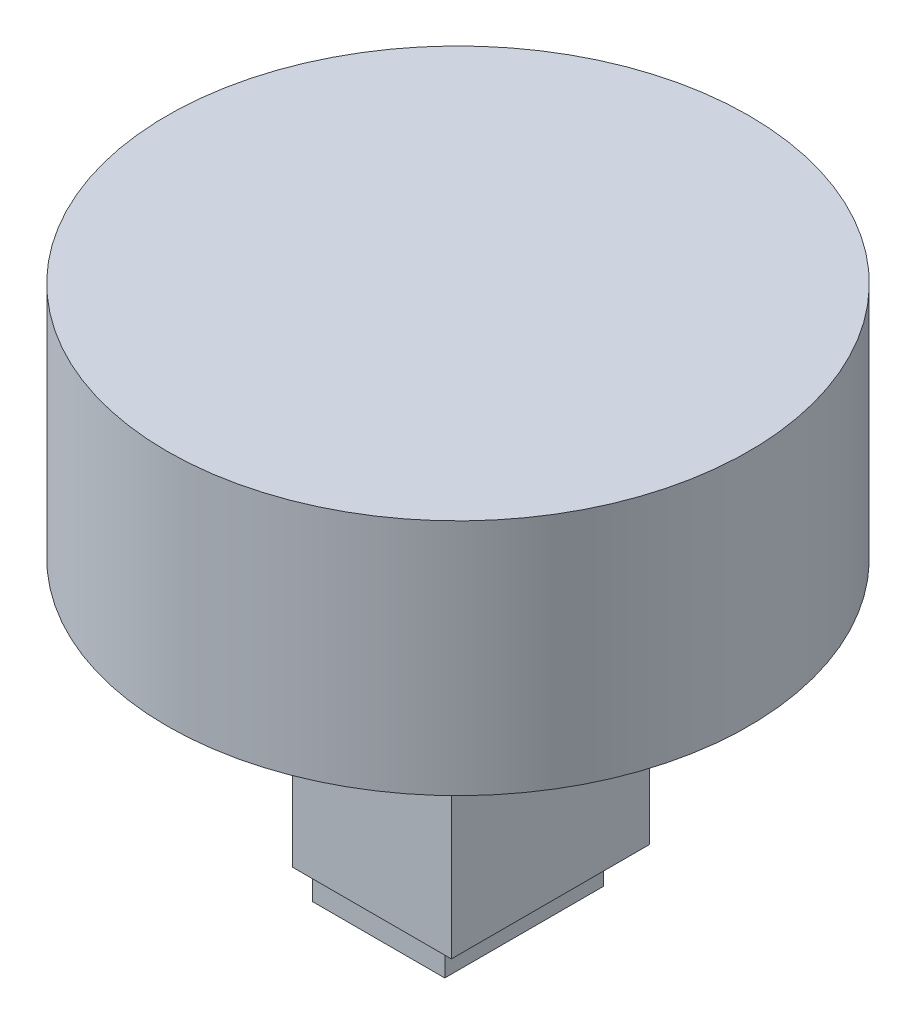
ISO-10303-21;
HEADER;
FILE_DESCRIPTION(('STEP AP214'),'2;1');
FILE_NAME('part.step','',(''),(''),'','','');
FILE_SCHEMA(('AUTOMOTIVE_DESIGN { 1 0 10303 214 1 1 1 1 }'));
ENDSEC;
DATA;
#1=APPLICATION_CONTEXT('core data for automotive mechanical design processes');
#2=APPLICATION_PROTOCOL_DEFINITION('international standard','automotive_design',2000,#1);
#3=PRODUCT_CONTEXT('',#1,'mechanical');
#4=PRODUCT('Part','Part','',(#3));
#5=PRODUCT_RELATED_PRODUCT_CATEGORY('part','',(#4));
#6=PRODUCT_DEFINITION_FORMATION('','',#4);
#7=PRODUCT_DEFINITION_CONTEXT('part definition',#1,'design');
#8=PRODUCT_DEFINITION('design','',#6,#7);
#9=PRODUCT_DEFINITION_SHAPE('','',#8);
#10=(LENGTH_UNIT() NAMED_UNIT(*) SI_UNIT(.MILLI.,.METRE.));
#11=(NAMED_UNIT(*) PLANE_ANGLE_UNIT() SI_UNIT($,.RADIAN.));
#12=(NAMED_UNIT(*) SI_UNIT($,.STERADIAN.) SOLID_ANGLE_UNIT());
#13=UNCERTAINTY_MEASURE_WITH_UNIT(LENGTH_MEASURE(1.E-05),#10,'distance_accuracy_value','');
#14=(GEOMETRIC_REPRESENTATION_CONTEXT(3) GLOBAL_UNCERTAINTY_ASSIGNED_CONTEXT((#13)) GLOBAL_UNIT_ASSIGNED_CONTEXT((#10,
#11,#12)) REPRESENTATION_CONTEXT('',''));
#15=CARTESIAN_POINT('',(0.,0.,0.));
#16=DIRECTION('',(0.,0.,1.));
#17=DIRECTION('',(1.,0.,0.));
#18=AXIS2_PLACEMENT_3D('',#15,#16,#17);
#19=CARTESIAN_POINT('',(5.,-22.,6.));
#20=DIRECTION('',(-1.,0.,0.));
#21=DIRECTION('',(0.,0.,1.));
#22=AXIS2_PLACEMENT_3D('',#19,#20,#21);
#23=PLANE('',#22);
#24=DIRECTION('',(0.,1.,0.));
#25=VECTOR('',#24,1.);
#26=CARTESIAN_POINT('',(5.,-22.,-6.));
#27=LINE('',#26,#25);
#28=CARTESIAN_POINT('',(5.,-22.,-6.));
#29=VERTEX_POINT('',#28);
#30=CARTESIAN_POINT('',(5.,-19.,-6.));
#31=VERTEX_POINT('',#30);
#32=EDGE_CURVE('E199',#29,#31,#27,.T.);
#33=ORIENTED_EDGE('',*,*,#32,.T.);
#34=DIRECTION('',(0.,0.,1.));
#35=VECTOR('',#34,1.);
#36=CARTESIAN_POINT('',(5.,-19.,6.));
#37=LINE('',#36,#35);
#38=CARTESIAN_POINT('',(5.,-19.,6.));
#39=VERTEX_POINT('',#38);
#40=EDGE_CURVE('E58',#31,#39,#37,.T.);
#41=ORIENTED_EDGE('',*,*,#40,.T.);
#42=DIRECTION('',(0.,1.,0.));
#43=VECTOR('',#42,1.);
#44=CARTESIAN_POINT('',(5.,-22.,6.));
#45=LINE('',#44,#43);
#46=CARTESIAN_POINT('',(5.,-22.,6.));
#47=VERTEX_POINT('',#46);
#48=EDGE_CURVE('E209',#47,#39,#45,.T.);
#49=ORIENTED_EDGE('',*,*,#48,.F.);
#50=DIRECTION('',(0.,0.,1.));
#51=VECTOR('',#50,1.);
#52=CARTESIAN_POINT('',(5.,-22.,6.));
#53=LINE('',#52,#51);
#54=EDGE_CURVE('E178',#29,#47,#53,.T.);
#55=ORIENTED_EDGE('',*,*,#54,.F.);
#56=EDGE_LOOP('',(#33,#41,#49,#55));
#57=FACE_BOUND('',#56,.T.);
#58=ADVANCED_FACE('F35',(#57),#23,.F.);
#59=CARTESIAN_POINT('',(-5.,-22.,6.));
#60=DIRECTION('',(0.,0.,-1.));
#61=DIRECTION('',(-1.,0.,0.));
#62=AXIS2_PLACEMENT_3D('',#59,#60,#61);
#63=PLANE('',#62);
#64=ORIENTED_EDGE('',*,*,#48,.T.);
#65=DIRECTION('',(-1.,0.,0.));
#66=VECTOR('',#65,1.);
#67=CARTESIAN_POINT('',(-5.,-19.,6.));
#68=LINE('',#67,#66);
#69=CARTESIAN_POINT('',(-5.,-19.,6.));
#70=VERTEX_POINT('',#69);
#71=EDGE_CURVE('E175',#39,#70,#68,.T.);
#72=ORIENTED_EDGE('',*,*,#71,.T.);
#73=DIRECTION('',(0.,1.,0.));
#74=VECTOR('',#73,1.);
#75=CARTESIAN_POINT('',(-5.,-22.,6.));
#76=LINE('',#75,#74);
#77=CARTESIAN_POINT('',(-5.,-22.,6.));
#78=VERTEX_POINT('',#77);
#79=EDGE_CURVE('E205',#78,#70,#76,.T.);
#80=ORIENTED_EDGE('',*,*,#79,.F.);
#81=DIRECTION('',(-1.,0.,0.));
#82=VECTOR('',#81,1.);
#83=CARTESIAN_POINT('',(-5.,-22.,6.));
#84=LINE('',#83,#82);
#85=EDGE_CURVE('E181',#47,#78,#84,.T.);
#86=ORIENTED_EDGE('',*,*,#85,.F.);
#87=EDGE_LOOP('',(#64,#72,#80,#86));
#88=FACE_BOUND('',#87,.T.);
#89=ADVANCED_FACE('F254',(#88),#63,.F.);
#90=CARTESIAN_POINT('',(-5.,-22.,-6.));
#91=DIRECTION('',(0.,0.,1.));
#92=DIRECTION('',(1.,0.,0.));
#93=AXIS2_PLACEMENT_3D('',#90,#91,#92);
#94=PLANE('',#93);
#95=DIRECTION('',(0.,1.,0.));
#96=VECTOR('',#95,1.);
#97=CARTESIAN_POINT('',(-5.,-22.,-6.));
#98=LINE('',#97,#96);
#99=CARTESIAN_POINT('',(-5.,-22.,-6.));
#100=VERTEX_POINT('',#99);
#101=CARTESIAN_POINT('',(-5.,-19.,-6.));
#102=VERTEX_POINT('',#101);
#103=EDGE_CURVE('E202',#100,#102,#98,.T.);
#104=ORIENTED_EDGE('',*,*,#103,.T.);
#105=DIRECTION('',(1.,0.,0.));
#106=VECTOR('',#105,1.);
#107=CARTESIAN_POINT('',(-5.,-19.,-6.));
#108=LINE('',#107,#106);
#109=EDGE_CURVE('E11',#102,#31,#108,.T.);
#110=ORIENTED_EDGE('',*,*,#109,.T.);
#111=ORIENTED_EDGE('',*,*,#32,.F.);
#112=DIRECTION('',(1.,0.,0.));
#113=VECTOR('',#112,1.);
#114=CARTESIAN_POINT('',(-5.,-22.,-6.));
#115=LINE('',#114,#113);
#116=EDGE_CURVE('E186',#100,#29,#115,.T.);
#117=ORIENTED_EDGE('',*,*,#116,.F.);
#118=EDGE_LOOP('',(#104,#110,#111,#117));
#119=FACE_BOUND('',#118,.T.);
#120=ADVANCED_FACE('F248',(#119),#94,.F.);
#121=CARTESIAN_POINT('',(0.,0.,0.));
#122=DIRECTION('',(0.,1.,0.));
#123=DIRECTION('',(0.,0.,1.));
#124=AXIS2_PLACEMENT_3D('',#121,#122,#123);
#125=PLANE('',#124);
#126=CARTESIAN_POINT('',(0.,0.,0.));
#127=DIRECTION('',(0.,1.,0.));
#128=DIRECTION('',(0.,0.,1.));
#129=AXIS2_PLACEMENT_3D('',#126,#127,#128);
#130=CIRCLE('',#129,22.);
#131=CARTESIAN_POINT('',(0.,0.,22.));
#132=VERTEX_POINT('',#131);
#133=EDGE_CURVE('E211',#132,#132,#130,.T.);
#134=ORIENTED_EDGE('',*,*,#133,.F.);
#135=EDGE_LOOP('',(#134));
#136=FACE_BOUND('',#135,.T.);
#137=DIRECTION('',(0.,0.,1.));
#138=VECTOR('',#137,1.);
#139=CARTESIAN_POINT('',(5.,0.,6.));
#140=LINE('',#139,#138);
#141=CARTESIAN_POINT('',(5.,0.,-6.));
#142=VERTEX_POINT('',#141);
#143=CARTESIAN_POINT('',(5.,0.,6.));
#144=VERTEX_POINT('',#143);
#145=EDGE_CURVE('E177',#142,#144,#140,.T.);
#146=ORIENTED_EDGE('',*,*,#145,.F.);
#147=DIRECTION('',(1.,0.,0.));
#148=VECTOR('',#147,1.);
#149=CARTESIAN_POINT('',(-5.,0.,-6.));
#150=LINE('',#149,#148);
#151=CARTESIAN_POINT('',(-5.,0.,-6.));
#152=VERTEX_POINT('',#151);
#153=EDGE_CURVE('E182',#152,#142,#150,.T.);
#154=ORIENTED_EDGE('',*,*,#153,.F.);
#155=DIRECTION('',(0.,0.,-1.));
#156=VECTOR('',#155,1.);
#157=CARTESIAN_POINT('',(-5.,0.,6.));
#158=LINE('',#157,#156);
#159=CARTESIAN_POINT('',(-5.,0.,6.));
#160=VERTEX_POINT('',#159);
#161=EDGE_CURVE('E194',#160,#152,#158,.T.);
#162=ORIENTED_EDGE('',*,*,#161,.F.);
#163=DIRECTION('',(-1.,0.,0.));
#164=VECTOR('',#163,1.);
#165=CARTESIAN_POINT('',(-5.,0.,6.));
#166=LINE('',#165,#164);
#167=EDGE_CURVE('E191',#144,#160,#166,.T.);
#168=ORIENTED_EDGE('',*,*,#167,.F.);
#169=EDGE_LOOP('',(#146,#154,#162,#168));
#170=FACE_BOUND('',#169,.T.);
#171=ADVANCED_FACE('F230',(#136,#170),#125,.F.);
#172=CARTESIAN_POINT('',(0.,18.,0.));
#173=DIRECTION('',(0.,-1.,0.));
#174=DIRECTION('',(0.,0.,-1.));
#175=AXIS2_PLACEMENT_3D('',#172,#173,#174);
#176=CYLINDRICAL_SURFACE('',#175,22.);
#177=CARTESIAN_POINT('',(0.,18.,0.));
#178=DIRECTION('',(0.,1.,0.));
#179=DIRECTION('',(0.,0.,1.));
#180=AXIS2_PLACEMENT_3D('',#177,#178,#179);
#181=CIRCLE('',#180,22.);
#182=CARTESIAN_POINT('',(0.,18.,22.));
#183=VERTEX_POINT('',#182);
#184=EDGE_CURVE('E212',#183,#183,#181,.T.);
#185=ORIENTED_EDGE('',*,*,#184,.F.);
#186=EDGE_LOOP('',(#185));
#187=FACE_BOUND('',#186,.T.);
#188=ORIENTED_EDGE('',*,*,#133,.T.);
#189=EDGE_LOOP('',(#188));
#190=FACE_BOUND('',#189,.T.);
#191=ADVANCED_FACE('F37',(#187,#190),#176,.T.);
#192=CARTESIAN_POINT('',(0.,18.,0.));
#193=DIRECTION('',(0.,1.,0.));
#194=DIRECTION('',(0.,0.,1.));
#195=AXIS2_PLACEMENT_3D('',#192,#193,#194);
#196=PLANE('',#195);
#197=ORIENTED_EDGE('',*,*,#184,.T.);
#198=EDGE_LOOP('',(#197));
#199=FACE_BOUND('',#198,.T.);
#200=ADVANCED_FACE('F263',(#199),#196,.T.);
#201=CARTESIAN_POINT('',(5.,-7.,6.));
#202=VERTEX_POINT('',#201);
#203=EDGE_CURVE('E208',#202,#144,#45,.T.);
#204=ORIENTED_EDGE('',*,*,#203,.F.);
#205=DIRECTION('',(0.,0.,-1.));
#206=VECTOR('',#205,1.);
#207=CARTESIAN_POINT('',(5.,-7.,6.));
#208=LINE('',#207,#206);
#209=CARTESIAN_POINT('',(5.,-7.,-6.));
#210=VERTEX_POINT('',#209);
#211=EDGE_CURVE('E171',#202,#210,#208,.T.);
#212=ORIENTED_EDGE('',*,*,#211,.T.);
#213=EDGE_CURVE('E188',#210,#142,#27,.T.);
#214=ORIENTED_EDGE('',*,*,#213,.T.);
#215=ORIENTED_EDGE('',*,*,#145,.T.);
#216=EDGE_LOOP('',(#204,#212,#214,#215));
#217=FACE_BOUND('',#216,.T.);
#218=ADVANCED_FACE('F233',(#217),#23,.F.);
#219=CARTESIAN_POINT('',(-5.,-7.,6.));
#220=VERTEX_POINT('',#219);
#221=EDGE_CURVE('E204',#220,#160,#76,.T.);
#222=ORIENTED_EDGE('',*,*,#221,.F.);
#223=DIRECTION('',(1.,0.,0.));
#224=VECTOR('',#223,1.);
#225=CARTESIAN_POINT('',(-5.,-7.,6.));
#226=LINE('',#225,#224);
#227=EDGE_CURVE('E50',#220,#202,#226,.T.);
#228=ORIENTED_EDGE('',*,*,#227,.T.);
#229=ORIENTED_EDGE('',*,*,#203,.T.);
#230=ORIENTED_EDGE('',*,*,#167,.T.);
#231=EDGE_LOOP('',(#222,#228,#229,#230));
#232=FACE_BOUND('',#231,.T.);
#233=ADVANCED_FACE('F231',(#232),#63,.F.);
#234=CARTESIAN_POINT('',(-5.,-22.,6.));
#235=DIRECTION('',(1.,0.,0.));
#236=DIRECTION('',(0.,0.,-1.));
#237=AXIS2_PLACEMENT_3D('',#234,#235,#236);
#238=PLANE('',#237);
#239=CARTESIAN_POINT('',(-5.,-7.,-6.));
#240=VERTEX_POINT('',#239);
#241=EDGE_CURVE('E201',#240,#152,#98,.T.);
#242=ORIENTED_EDGE('',*,*,#241,.F.);
#243=DIRECTION('',(0.,0.,-1.));
#244=VECTOR('',#243,1.);
#245=CARTESIAN_POINT('',(-5.,-7.,7.5));
#246=LINE('',#245,#244);
#247=CARTESIAN_POINT('',(-5.,-7.,-7.50000000000001));
#248=VERTEX_POINT('',#247);
#249=EDGE_CURVE('E163',#240,#248,#246,.T.);
#250=ORIENTED_EDGE('',*,*,#249,.T.);
#251=DIRECTION('',(0.,-1.,0.));
#252=VECTOR('',#251,1.);
#253=CARTESIAN_POINT('',(-5.,-19.,-7.5));
#254=LINE('',#253,#252);
#255=CARTESIAN_POINT('',(-5.,-19.,-7.5));
#256=VERTEX_POINT('',#255);
#257=EDGE_CURVE('E132',#248,#256,#254,.T.);
#258=ORIENTED_EDGE('',*,*,#257,.T.);
#259=DIRECTION('',(0.,0.,1.));
#260=VECTOR('',#259,1.);
#261=CARTESIAN_POINT('',(-5.,-19.,7.5));
#262=LINE('',#261,#260);
#263=EDGE_CURVE('E159',#256,#102,#262,.T.);
#264=ORIENTED_EDGE('',*,*,#263,.T.);
#265=ORIENTED_EDGE('',*,*,#103,.F.);
#266=DIRECTION('',(0.,0.,-1.));
#267=VECTOR('',#266,1.);
#268=CARTESIAN_POINT('',(-5.,-22.,6.));
#269=LINE('',#268,#267);
#270=EDGE_CURVE('E184',#78,#100,#269,.T.);
#271=ORIENTED_EDGE('',*,*,#270,.F.);
#272=ORIENTED_EDGE('',*,*,#79,.T.);
#273=CARTESIAN_POINT('',(-5.,-19.,7.5));
#274=VERTEX_POINT('',#273);
#275=EDGE_CURVE('E157',#70,#274,#262,.T.);
#276=ORIENTED_EDGE('',*,*,#275,.T.);
#277=DIRECTION('',(0.,1.,0.));
#278=VECTOR('',#277,1.);
#279=CARTESIAN_POINT('',(-5.,-19.,7.5));
#280=LINE('',#279,#278);
#281=CARTESIAN_POINT('',(-5.,-7.,7.5));
#282=VERTEX_POINT('',#281);
#283=EDGE_CURVE('E155',#274,#282,#280,.T.);
#284=ORIENTED_EDGE('',*,*,#283,.T.);
#285=EDGE_CURVE('E168',#282,#220,#246,.T.);
#286=ORIENTED_EDGE('',*,*,#285,.T.);
#287=ORIENTED_EDGE('',*,*,#221,.T.);
#288=ORIENTED_EDGE('',*,*,#161,.T.);
#289=EDGE_LOOP('',(#242,#250,#258,#264,#265,#271,#272,#276,#284,#286,#287,#288));
#290=FACE_BOUND('',#289,.T.);
#291=ADVANCED_FACE('F224',(#290),#238,.F.);
#292=ORIENTED_EDGE('',*,*,#213,.F.);
#293=DIRECTION('',(-1.,0.,0.));
#294=VECTOR('',#293,1.);
#295=CARTESIAN_POINT('',(-5.,-7.,-6.));
#296=LINE('',#295,#294);
#297=EDGE_CURVE('E43',#210,#240,#296,.T.);
#298=ORIENTED_EDGE('',*,*,#297,.T.);
#299=ORIENTED_EDGE('',*,*,#241,.T.);
#300=ORIENTED_EDGE('',*,*,#153,.T.);
#301=EDGE_LOOP('',(#292,#298,#299,#300));
#302=FACE_BOUND('',#301,.T.);
#303=ADVANCED_FACE('F220',(#302),#94,.F.);
#304=CARTESIAN_POINT('',(0.,-22.,0.));
#305=DIRECTION('',(0.,-1.,0.));
#306=DIRECTION('',(0.,0.,-1.));
#307=AXIS2_PLACEMENT_3D('',#304,#305,#306);
#308=PLANE('',#307);
#309=ORIENTED_EDGE('',*,*,#54,.T.);
#310=ORIENTED_EDGE('',*,*,#85,.T.);
#311=ORIENTED_EDGE('',*,*,#270,.T.);
#312=ORIENTED_EDGE('',*,*,#116,.T.);
#313=EDGE_LOOP('',(#309,#310,#311,#312));
#314=FACE_BOUND('',#313,.T.);
#315=ADVANCED_FACE('F251',(#314),#308,.T.);
#316=CARTESIAN_POINT('',(-24.2093727122985,-19.,7.49999999999999));
#317=DIRECTION('',(0.,-1.,0.));
#318=DIRECTION('',(0.,0.,-1.));
#319=AXIS2_PLACEMENT_3D('',#316,#317,#318);
#320=PLANE('',#319);
#321=ORIENTED_EDGE('',*,*,#71,.F.);
#322=ORIENTED_EDGE('',*,*,#40,.F.);
#323=ORIENTED_EDGE('',*,*,#109,.F.);
#324=ORIENTED_EDGE('',*,*,#263,.F.);
#325=DIRECTION('',(1.,0.,0.));
#326=VECTOR('',#325,1.);
#327=CARTESIAN_POINT('',(-24.2093727122985,-19.,-7.50000000000001));
#328=LINE('',#327,#326);
#329=CARTESIAN_POINT('',(7.,-19.,-7.5));
#330=VERTEX_POINT('',#329);
#331=EDGE_CURVE('E158',#256,#330,#328,.T.);
#332=ORIENTED_EDGE('',*,*,#331,.T.);
#333=DIRECTION('',(0.,0.,-1.));
#334=VECTOR('',#333,1.);
#335=CARTESIAN_POINT('',(7.,-19.,7.5));
#336=LINE('',#335,#334);
#337=CARTESIAN_POINT('',(7.,-19.,7.5));
#338=VERTEX_POINT('',#337);
#339=EDGE_CURVE('E136',#338,#330,#336,.T.);
#340=ORIENTED_EDGE('',*,*,#339,.F.);
#341=DIRECTION('',(1.,0.,0.));
#342=VECTOR('',#341,1.);
#343=CARTESIAN_POINT('',(-24.2093727122985,-19.,7.49999999999999));
#344=LINE('',#343,#342);
#345=EDGE_CURVE('E165',#274,#338,#344,.T.);
#346=ORIENTED_EDGE('',*,*,#345,.F.);
#347=ORIENTED_EDGE('',*,*,#275,.F.);
#348=EDGE_LOOP('',(#321,#322,#323,#324,#332,#340,#346,#347));
#349=FACE_BOUND('',#348,.T.);
#350=ADVANCED_FACE('F241',(#349),#320,.T.);
#351=CARTESIAN_POINT('',(-24.2093727122985,-7.,7.49999999999999));
#352=DIRECTION('',(0.,1.,0.));
#353=DIRECTION('',(0.,0.,1.));
#354=AXIS2_PLACEMENT_3D('',#351,#352,#353);
#355=PLANE('',#354);
#356=ORIENTED_EDGE('',*,*,#227,.F.);
#357=ORIENTED_EDGE('',*,*,#285,.F.);
#358=DIRECTION('',(1.,0.,0.));
#359=VECTOR('',#358,1.);
#360=CARTESIAN_POINT('',(-24.2093727122985,-7.,7.49999999999999));
#361=LINE('',#360,#359);
#362=CARTESIAN_POINT('',(7.,-7.,7.5));
#363=VERTEX_POINT('',#362);
#364=EDGE_CURVE('E135',#282,#363,#361,.T.);
#365=ORIENTED_EDGE('',*,*,#364,.T.);
#366=DIRECTION('',(0.,0.,1.));
#367=VECTOR('',#366,1.);
#368=CARTESIAN_POINT('',(7.,-7.,7.5));
#369=LINE('',#368,#367);
#370=CARTESIAN_POINT('',(7.,-7.,-7.5));
#371=VERTEX_POINT('',#370);
#372=EDGE_CURVE('E139',#371,#363,#369,.T.);
#373=ORIENTED_EDGE('',*,*,#372,.F.);
#374=DIRECTION('',(1.,0.,0.));
#375=VECTOR('',#374,1.);
#376=CARTESIAN_POINT('',(-24.2093727122985,-7.,-7.50000000000001));
#377=LINE('',#376,#375);
#378=EDGE_CURVE('E126',#248,#371,#377,.T.);
#379=ORIENTED_EDGE('',*,*,#378,.F.);
#380=ORIENTED_EDGE('',*,*,#249,.F.);
#381=ORIENTED_EDGE('',*,*,#297,.F.);
#382=ORIENTED_EDGE('',*,*,#211,.F.);
#383=EDGE_LOOP('',(#356,#357,#365,#373,#379,#380,#381,#382));
#384=FACE_BOUND('',#383,.T.);
#385=ADVANCED_FACE('F140',(#384),#355,.T.);
#386=CARTESIAN_POINT('',(-24.2093727122985,-19.,-7.50000000000001));
#387=DIRECTION('',(0.,0.,-1.));
#388=DIRECTION('',(-1.,0.,0.));
#389=AXIS2_PLACEMENT_3D('',#386,#387,#388);
#390=PLANE('',#389);
#391=ORIENTED_EDGE('',*,*,#257,.F.);
#392=ORIENTED_EDGE('',*,*,#378,.T.);
#393=DIRECTION('',(0.,1.,0.));
#394=VECTOR('',#393,1.);
#395=CARTESIAN_POINT('',(7.,-19.,-7.5));
#396=LINE('',#395,#394);
#397=EDGE_CURVE('E131',#330,#371,#396,.T.);
#398=ORIENTED_EDGE('',*,*,#397,.F.);
#399=ORIENTED_EDGE('',*,*,#331,.F.);
#400=EDGE_LOOP('',(#391,#392,#398,#399));
#401=FACE_BOUND('',#400,.T.);
#402=ADVANCED_FACE('F128',(#401),#390,.T.);
#403=CARTESIAN_POINT('',(-24.2093727122985,-19.,7.49999999999999));
#404=DIRECTION('',(0.,0.,1.));
#405=DIRECTION('',(1.,0.,0.));
#406=AXIS2_PLACEMENT_3D('',#403,#404,#405);
#407=PLANE('',#406);
#408=ORIENTED_EDGE('',*,*,#283,.F.);
#409=ORIENTED_EDGE('',*,*,#345,.T.);
#410=DIRECTION('',(0.,-1.,0.));
#411=VECTOR('',#410,1.);
#412=CARTESIAN_POINT('',(7.,-19.,7.5));
#413=LINE('',#412,#411);
#414=EDGE_CURVE('E146',#363,#338,#413,.T.);
#415=ORIENTED_EDGE('',*,*,#414,.F.);
#416=ORIENTED_EDGE('',*,*,#364,.F.);
#417=EDGE_LOOP('',(#408,#409,#415,#416));
#418=FACE_BOUND('',#417,.T.);
#419=ADVANCED_FACE('F238',(#418),#407,.T.);
#420=CARTESIAN_POINT('',(7.,0.,0.));
#421=DIRECTION('',(-1.,0.,0.));
#422=DIRECTION('',(0.,0.,1.));
#423=AXIS2_PLACEMENT_3D('',#420,#421,#422);
#424=PLANE('',#423);
#425=ORIENTED_EDGE('',*,*,#397,.T.);
#426=ORIENTED_EDGE('',*,*,#372,.T.);
#427=ORIENTED_EDGE('',*,*,#414,.T.);
#428=ORIENTED_EDGE('',*,*,#339,.T.);
#429=EDGE_LOOP('',(#425,#426,#427,#428));
#430=FACE_BOUND('',#429,.T.);
#431=ADVANCED_FACE('F149',(#430),#424,.F.);
#432=CLOSED_SHELL('',(#58,#89,#120,#171,#191,#200,#218,#233,#291,#303,#315,#350,#385,#402,#419,#431));
#433=MANIFOLD_SOLID_BREP('B2',#432);
#434=ADVANCED_BREP_SHAPE_REPRESENTATION('',(#18,#433),#14);
#435=SHAPE_DEFINITION_REPRESENTATION(#9,#434);
ENDSEC;
END-ISO-10303-21;
